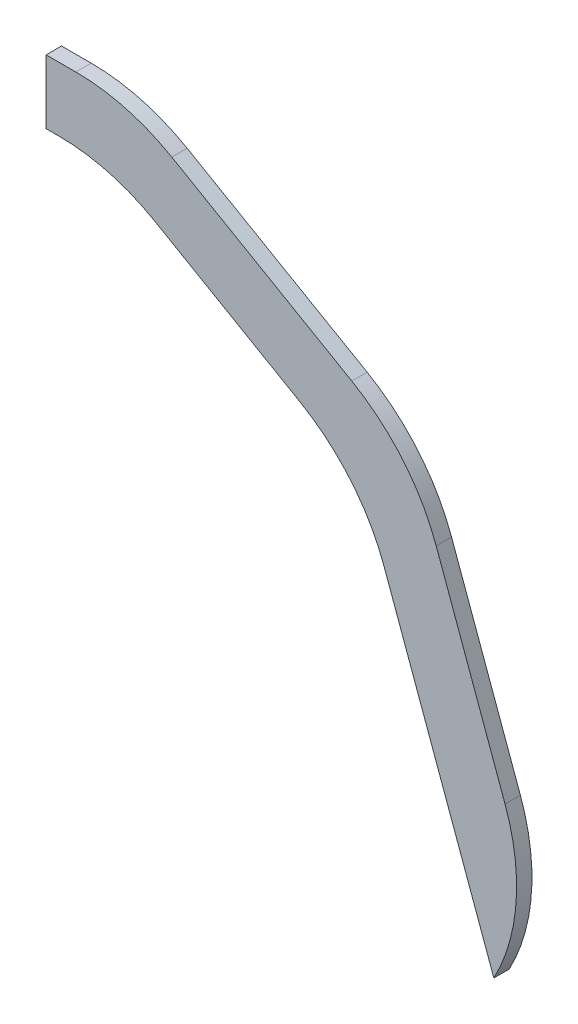
ISO-10303-21;
HEADER;
FILE_DESCRIPTION(('STEP AP214'),'2;1');
FILE_NAME('part.step','',(''),(''),'','','');
FILE_SCHEMA(('AUTOMOTIVE_DESIGN { 1 0 10303 214 1 1 1 1 }'));
ENDSEC;
DATA;
#1=APPLICATION_CONTEXT('core data for automotive mechanical design processes');
#2=APPLICATION_PROTOCOL_DEFINITION('international standard','automotive_design',2000,#1);
#3=PRODUCT_CONTEXT('',#1,'mechanical');
#4=PRODUCT('Part','Part','',(#3));
#5=PRODUCT_RELATED_PRODUCT_CATEGORY('part','',(#4));
#6=PRODUCT_DEFINITION_FORMATION('','',#4);
#7=PRODUCT_DEFINITION_CONTEXT('part definition',#1,'design');
#8=PRODUCT_DEFINITION('design','',#6,#7);
#9=PRODUCT_DEFINITION_SHAPE('','',#8);
#10=(LENGTH_UNIT() NAMED_UNIT(*) SI_UNIT(.MILLI.,.METRE.));
#11=(NAMED_UNIT(*) PLANE_ANGLE_UNIT() SI_UNIT($,.RADIAN.));
#12=(NAMED_UNIT(*) SI_UNIT($,.STERADIAN.) SOLID_ANGLE_UNIT());
#13=UNCERTAINTY_MEASURE_WITH_UNIT(LENGTH_MEASURE(1.E-05),#10,'distance_accuracy_value','');
#14=(GEOMETRIC_REPRESENTATION_CONTEXT(3) GLOBAL_UNCERTAINTY_ASSIGNED_CONTEXT((#13)) GLOBAL_UNIT_ASSIGNED_CONTEXT((#10,
#11,#12)) REPRESENTATION_CONTEXT('',''));
#15=CARTESIAN_POINT('',(0.,0.,0.));
#16=DIRECTION('',(0.,0.,1.));
#17=DIRECTION('',(1.,0.,0.));
#18=AXIS2_PLACEMENT_3D('',#15,#16,#17);
#19=CARTESIAN_POINT('',(0.,1.,0.12));
#20=DIRECTION('',(1.,0.,0.));
#21=DIRECTION('',(0.,1.,0.));
#22=AXIS2_PLACEMENT_3D('',#19,#20,#21);
#23=PLANE('',#22);
#24=DIRECTION('',(0.,-1.,0.));
#25=VECTOR('',#24,1.);
#26=CARTESIAN_POINT('',(0.,1.,-0.12));
#27=LINE('',#26,#25);
#28=CARTESIAN_POINT('',(0.,1.,-0.12));
#29=VERTEX_POINT('',#28);
#30=CARTESIAN_POINT('',(0.,0.,-0.12));
#31=VERTEX_POINT('',#30);
#32=EDGE_CURVE('E154',#29,#31,#27,.T.);
#33=ORIENTED_EDGE('',*,*,#32,.T.);
#34=DIRECTION('',(0.,0.,-1.));
#35=VECTOR('',#34,1.);
#36=CARTESIAN_POINT('',(0.,0.,0.12));
#37=LINE('',#36,#35);
#38=CARTESIAN_POINT('',(0.,0.,0.12));
#39=VERTEX_POINT('',#38);
#40=EDGE_CURVE('E133',#39,#31,#37,.T.);
#41=ORIENTED_EDGE('',*,*,#40,.F.);
#42=DIRECTION('',(0.,-1.,0.));
#43=VECTOR('',#42,1.);
#44=CARTESIAN_POINT('',(0.,1.,0.12));
#45=LINE('',#44,#43);
#46=CARTESIAN_POINT('',(0.,1.,0.12));
#47=VERTEX_POINT('',#46);
#48=EDGE_CURVE('E140',#47,#39,#45,.T.);
#49=ORIENTED_EDGE('',*,*,#48,.F.);
#50=DIRECTION('',(0.,0.,-1.));
#51=VECTOR('',#50,1.);
#52=CARTESIAN_POINT('',(0.,1.,0.12));
#53=LINE('',#52,#51);
#54=EDGE_CURVE('E165',#47,#29,#53,.T.);
#55=ORIENTED_EDGE('',*,*,#54,.T.);
#56=EDGE_LOOP('',(#33,#41,#49,#55));
#57=FACE_BOUND('',#56,.T.);
#58=ADVANCED_FACE('F38',(#57),#23,.F.);
#59=CARTESIAN_POINT('',(0.,0.,0.12));
#60=DIRECTION('',(0.,1.,0.));
#61=DIRECTION('',(0.,0.,1.));
#62=AXIS2_PLACEMENT_3D('',#59,#60,#61);
#63=PLANE('',#62);
#64=DIRECTION('',(1.,0.,0.));
#65=VECTOR('',#64,1.);
#66=CARTESIAN_POINT('',(0.,0.,-0.12));
#67=LINE('',#66,#65);
#68=CARTESIAN_POINT('',(0.19615242270663,0.,-0.12));
#69=VERTEX_POINT('',#68);
#70=EDGE_CURVE('E221',#31,#69,#67,.T.);
#71=ORIENTED_EDGE('',*,*,#70,.T.);
#72=DIRECTION('',(0.,0.,-1.));
#73=VECTOR('',#72,1.);
#74=CARTESIAN_POINT('',(0.19615242270663,0.,0.12));
#75=LINE('',#74,#73);
#76=CARTESIAN_POINT('',(0.19615242270663,0.,0.12));
#77=VERTEX_POINT('',#76);
#78=EDGE_CURVE('E136',#69,#77,#75,.F.);
#79=ORIENTED_EDGE('',*,*,#78,.T.);
#80=DIRECTION('',(1.,0.,0.));
#81=VECTOR('',#80,1.);
#82=CARTESIAN_POINT('',(0.,0.,0.12));
#83=LINE('',#82,#81);
#84=EDGE_CURVE('E128',#39,#77,#83,.T.);
#85=ORIENTED_EDGE('',*,*,#84,.F.);
#86=ORIENTED_EDGE('',*,*,#40,.T.);
#87=EDGE_LOOP('',(#71,#79,#85,#86));
#88=FACE_BOUND('',#87,.T.);
#89=ADVANCED_FACE('F131',(#88),#63,.F.);
#90=CARTESIAN_POINT('',(1.,0.,0.12));
#91=DIRECTION('',(0.500000000000001,0.866025403784438,0.));
#92=DIRECTION('',(-0.866025403784438,0.500000000000001,0.));
#93=AXIS2_PLACEMENT_3D('',#90,#91,#92);
#94=PLANE('',#93);
#95=DIRECTION('',(0.866025403784438,-0.500000000000001,0.));
#96=VECTOR('',#95,1.);
#97=CARTESIAN_POINT('',(1.,0.,-0.12));
#98=LINE('',#97,#96);
#99=CARTESIAN_POINT('',(1.69615242270663,-0.401923788646686,-0.12));
#100=VERTEX_POINT('',#99);
#101=CARTESIAN_POINT('',(3.96422431099867,-1.71139570389352,-0.12));
#102=VERTEX_POINT('',#101);
#103=EDGE_CURVE('E223',#100,#102,#98,.T.);
#104=ORIENTED_EDGE('',*,*,#103,.T.);
#105=DIRECTION('',(0.,0.,-1.));
#106=VECTOR('',#105,1.);
#107=CARTESIAN_POINT('',(3.96422431099867,-1.71139570389352,0.12));
#108=LINE('',#107,#106);
#109=CARTESIAN_POINT('',(3.96422431099867,-1.71139570389352,0.12));
#110=VERTEX_POINT('',#109);
#111=EDGE_CURVE('E206',#102,#110,#108,.F.);
#112=ORIENTED_EDGE('',*,*,#111,.T.);
#113=DIRECTION('',(0.866025403784438,-0.500000000000001,0.));
#114=VECTOR('',#113,1.);
#115=CARTESIAN_POINT('',(1.,0.,0.12));
#116=LINE('',#115,#114);
#117=CARTESIAN_POINT('',(1.69615242270663,-0.401923788646686,0.12));
#118=VERTEX_POINT('',#117);
#119=EDGE_CURVE('E139',#118,#110,#116,.T.);
#120=ORIENTED_EDGE('',*,*,#119,.F.);
#121=DIRECTION('',(0.,0.,-1.));
#122=VECTOR('',#121,1.);
#123=CARTESIAN_POINT('',(1.69615242270663,-0.401923788646686,-0.12));
#124=LINE('',#123,#122);
#125=EDGE_CURVE('E202',#118,#100,#124,.T.);
#126=ORIENTED_EDGE('',*,*,#125,.T.);
#127=EDGE_LOOP('',(#104,#112,#120,#126));
#128=FACE_BOUND('',#127,.T.);
#129=ADVANCED_FACE('F232',(#128),#94,.F.);
#130=CARTESIAN_POINT('',(4.90984671828639,-2.25735105529283,0.12));
#131=DIRECTION('',(0.939692620785909,0.342020143325666,0.));
#132=DIRECTION('',(-0.342020143325666,0.939692620785909,0.));
#133=AXIS2_PLACEMENT_3D('',#130,#131,#132);
#134=PLANE('',#133);
#135=DIRECTION('',(0.342020143325666,-0.939692620785909,0.));
#136=VECTOR('',#135,1.);
#137=CARTESIAN_POINT('',(4.90984671828639,-2.25735105529283,0.12));
#138=LINE('',#137,#136);
#139=CARTESIAN_POINT('',(5.2833021733564,-3.28341148526984,0.12));
#140=VERTEX_POINT('',#139);
#141=CARTESIAN_POINT('',(7.,-8.,0.12));
#142=VERTEX_POINT('',#141);
#143=EDGE_CURVE('E235',#140,#142,#138,.T.);
#144=ORIENTED_EDGE('',*,*,#143,.F.);
#145=DIRECTION('',(0.,0.,-1.));
#146=VECTOR('',#145,1.);
#147=CARTESIAN_POINT('',(5.2833021733564,-3.28341148526984,-0.12));
#148=LINE('',#147,#146);
#149=CARTESIAN_POINT('',(5.2833021733564,-3.28341148526984,-0.12));
#150=VERTEX_POINT('',#149);
#151=EDGE_CURVE('E198',#140,#150,#148,.T.);
#152=ORIENTED_EDGE('',*,*,#151,.T.);
#153=DIRECTION('',(0.342020143325666,-0.939692620785909,0.));
#154=VECTOR('',#153,1.);
#155=CARTESIAN_POINT('',(4.90984671828639,-2.25735105529283,-0.12));
#156=LINE('',#155,#154);
#157=CARTESIAN_POINT('',(7.,-8.,-0.12));
#158=VERTEX_POINT('',#157);
#159=EDGE_CURVE('E252',#150,#158,#156,.T.);
#160=ORIENTED_EDGE('',*,*,#159,.T.);
#161=DIRECTION('',(0.,0.,-1.));
#162=VECTOR('',#161,1.);
#163=CARTESIAN_POINT('',(7.,-8.,0.12));
#164=LINE('',#163,#162);
#165=EDGE_CURVE('E157',#142,#158,#164,.T.);
#166=ORIENTED_EDGE('',*,*,#165,.F.);
#167=EDGE_LOOP('',(#144,#152,#160,#166));
#168=FACE_BOUND('',#167,.T.);
#169=ADVANCED_FACE('F289',(#168),#134,.F.);
#170=CARTESIAN_POINT('',(7.65270364466614,-6.86948412515286,0.12));
#171=DIRECTION('',(-0.939692620785909,-0.342020143325666,0.));
#172=DIRECTION('',(0.342020143325666,-0.939692620785909,0.));
#173=AXIS2_PLACEMENT_3D('',#170,#171,#172);
#174=PLANE('',#173);
#175=DIRECTION('',(-0.342020143325666,0.939692620785909,0.));
#176=VECTOR('',#175,1.);
#177=CARTESIAN_POINT('',(7.65270364466614,-6.86948412515286,-0.12));
#178=LINE('',#177,#176);
#179=CARTESIAN_POINT('',(7.1749123306355,-5.55676327864211,-0.12));
#180=VERTEX_POINT('',#179);
#181=CARTESIAN_POINT('',(6.0985096424523,-2.5993711986185,-0.12));
#182=VERTEX_POINT('',#181);
#183=EDGE_CURVE('E256',#180,#182,#178,.T.);
#184=ORIENTED_EDGE('',*,*,#183,.T.);
#185=DIRECTION('',(0.,0.,-1.));
#186=VECTOR('',#185,1.);
#187=CARTESIAN_POINT('',(6.0985096424523,-2.5993711986185,0.12));
#188=LINE('',#187,#186);
#189=CARTESIAN_POINT('',(6.0985096424523,-2.5993711986185,0.12));
#190=VERTEX_POINT('',#189);
#191=EDGE_CURVE('E54',#182,#190,#188,.F.);
#192=ORIENTED_EDGE('',*,*,#191,.T.);
#193=DIRECTION('',(-0.342020143325666,0.939692620785909,0.));
#194=VECTOR('',#193,1.);
#195=CARTESIAN_POINT('',(7.65270364466614,-6.86948412515286,0.12));
#196=LINE('',#195,#194);
#197=CARTESIAN_POINT('',(7.1749123306355,-5.55676327864211,0.12));
#198=VERTEX_POINT('',#197);
#199=EDGE_CURVE('E238',#198,#190,#196,.T.);
#200=ORIENTED_EDGE('',*,*,#199,.F.);
#201=DIRECTION('',(0.,0.,-1.));
#202=VECTOR('',#201,1.);
#203=CARTESIAN_POINT('',(7.1749123306355,-5.55676327864211,0.12));
#204=LINE('',#203,#202);
#205=EDGE_CURVE('E192',#198,#180,#204,.T.);
#206=ORIENTED_EDGE('',*,*,#205,.T.);
#207=EDGE_LOOP('',(#184,#192,#200,#206));
#208=FACE_BOUND('',#207,.T.);
#209=ADVANCED_FACE('F281',(#208),#174,.F.);
#210=CARTESIAN_POINT('',(5.72505418738229,-1.57331076864149,0.12));
#211=DIRECTION('',(-0.500000000000001,-0.866025403784438,0.));
#212=DIRECTION('',(0.866025403784438,-0.500000000000001,0.));
#213=AXIS2_PLACEMENT_3D('',#210,#211,#212);
#214=PLANE('',#213);
#215=DIRECTION('',(-0.866025403784438,0.500000000000001,0.));
#216=VECTOR('',#215,1.);
#217=CARTESIAN_POINT('',(5.72505418738229,-1.57331076864149,-0.12));
#218=LINE('',#217,#216);
#219=CARTESIAN_POINT('',(4.77943178009458,-1.02735541724218,-0.12));
#220=VERTEX_POINT('',#219);
#221=CARTESIAN_POINT('',(1.96410161513776,0.598076211353314,-0.12));
#222=VERTEX_POINT('',#221);
#223=EDGE_CURVE('E259',#220,#222,#218,.T.);
#224=ORIENTED_EDGE('',*,*,#223,.T.);
#225=DIRECTION('',(0.,0.,-1.));
#226=VECTOR('',#225,1.);
#227=CARTESIAN_POINT('',(1.96410161513776,0.598076211353314,0.12));
#228=LINE('',#227,#226);
#229=CARTESIAN_POINT('',(1.96410161513776,0.598076211353314,0.12));
#230=VERTEX_POINT('',#229);
#231=EDGE_CURVE('E181',#222,#230,#228,.F.);
#232=ORIENTED_EDGE('',*,*,#231,.T.);
#233=DIRECTION('',(-0.866025403784438,0.500000000000001,0.));
#234=VECTOR('',#233,1.);
#235=CARTESIAN_POINT('',(5.72505418738229,-1.57331076864149,0.12));
#236=LINE('',#235,#234);
#237=CARTESIAN_POINT('',(4.77943178009458,-1.02735541724218,0.12));
#238=VERTEX_POINT('',#237);
#239=EDGE_CURVE('E243',#238,#230,#236,.T.);
#240=ORIENTED_EDGE('',*,*,#239,.F.);
#241=DIRECTION('',(0.,0.,-1.));
#242=VECTOR('',#241,1.);
#243=CARTESIAN_POINT('',(4.77943178009458,-1.02735541724218,0.12));
#244=LINE('',#243,#242);
#245=EDGE_CURVE('E177',#238,#220,#244,.T.);
#246=ORIENTED_EDGE('',*,*,#245,.T.);
#247=EDGE_LOOP('',(#224,#232,#240,#246));
#248=FACE_BOUND('',#247,.T.);
#249=ADVANCED_FACE('F275',(#248),#214,.F.);
#250=CARTESIAN_POINT('',(1.26794919243112,1.,0.12));
#251=DIRECTION('',(0.,-1.,0.));
#252=DIRECTION('',(1.,0.,0.));
#253=AXIS2_PLACEMENT_3D('',#250,#251,#252);
#254=PLANE('',#253);
#255=DIRECTION('',(-1.,0.,0.));
#256=VECTOR('',#255,1.);
#257=CARTESIAN_POINT('',(1.26794919243112,1.,0.12));
#258=LINE('',#257,#256);
#259=CARTESIAN_POINT('',(0.464101615137752,1.,0.12));
#260=VERTEX_POINT('',#259);
#261=EDGE_CURVE('E146',#260,#47,#258,.T.);
#262=ORIENTED_EDGE('',*,*,#261,.F.);
#263=DIRECTION('',(0.,0.,-1.));
#264=VECTOR('',#263,1.);
#265=CARTESIAN_POINT('',(0.464101615137752,1.,0.12));
#266=LINE('',#265,#264);
#267=CARTESIAN_POINT('',(0.464101615137752,1.,-0.12));
#268=VERTEX_POINT('',#267);
#269=EDGE_CURVE('E156',#260,#268,#266,.T.);
#270=ORIENTED_EDGE('',*,*,#269,.T.);
#271=DIRECTION('',(-1.,0.,0.));
#272=VECTOR('',#271,1.);
#273=CARTESIAN_POINT('',(1.26794919243112,1.,-0.12));
#274=LINE('',#273,#272);
#275=EDGE_CURVE('E151',#268,#29,#274,.T.);
#276=ORIENTED_EDGE('',*,*,#275,.T.);
#277=ORIENTED_EDGE('',*,*,#54,.F.);
#278=EDGE_LOOP('',(#262,#270,#276,#277));
#279=FACE_BOUND('',#278,.T.);
#280=ADVANCED_FACE('F267',(#279),#254,.F.);
#281=CARTESIAN_POINT('',(0.,0.,0.12));
#282=DIRECTION('',(0.,0.,1.));
#283=DIRECTION('',(1.,0.,0.));
#284=AXIS2_PLACEMENT_3D('',#281,#282,#283);
#285=PLANE('',#284);
#286=ORIENTED_EDGE('',*,*,#239,.T.);
#287=CARTESIAN_POINT('',(0.464101615137753,-2.,0.12));
#288=DIRECTION('',(0.,0.,1.));
#289=DIRECTION('',(1.,0.,0.));
#290=AXIS2_PLACEMENT_3D('',#287,#288,#289);
#291=CIRCLE('',#290,3.);
#292=EDGE_CURVE('E189',#230,#260,#291,.T.);
#293=ORIENTED_EDGE('',*,*,#292,.T.);
#294=ORIENTED_EDGE('',*,*,#261,.T.);
#295=ORIENTED_EDGE('',*,*,#48,.T.);
#296=ORIENTED_EDGE('',*,*,#84,.T.);
#297=CARTESIAN_POINT('',(0.19615242270663,-3.,0.12));
#298=DIRECTION('',(0.,0.,1.));
#299=DIRECTION('',(1.,0.,0.));
#300=AXIS2_PLACEMENT_3D('',#297,#298,#299);
#301=CIRCLE('',#300,3.);
#302=EDGE_CURVE('E11',#77,#118,#301,.F.);
#303=ORIENTED_EDGE('',*,*,#302,.T.);
#304=ORIENTED_EDGE('',*,*,#119,.T.);
#305=CARTESIAN_POINT('',(2.46422431099867,-4.30947191524684,0.12));
#306=DIRECTION('',(0.,0.,1.));
#307=DIRECTION('',(1.,0.,0.));
#308=AXIS2_PLACEMENT_3D('',#305,#306,#307);
#309=CIRCLE('',#308,3.);
#310=EDGE_CURVE('E214',#110,#140,#309,.F.);
#311=ORIENTED_EDGE('',*,*,#310,.T.);
#312=ORIENTED_EDGE('',*,*,#143,.T.);
#313=CARTESIAN_POINT('',(4.35583446827777,-6.58282370861911,0.12));
#314=DIRECTION('',(0.,0.,1.));
#315=DIRECTION('',(1.,0.,0.));
#316=AXIS2_PLACEMENT_3D('',#313,#314,#315);
#317=CIRCLE('',#316,3.);
#318=EDGE_CURVE('E61',#142,#198,#317,.T.);
#319=ORIENTED_EDGE('',*,*,#318,.T.);
#320=ORIENTED_EDGE('',*,*,#199,.T.);
#321=CARTESIAN_POINT('',(3.27943178009457,-3.6254316285955,0.12));
#322=DIRECTION('',(0.,0.,1.));
#323=DIRECTION('',(1.,0.,0.));
#324=AXIS2_PLACEMENT_3D('',#321,#322,#323);
#325=CIRCLE('',#324,3.);
#326=EDGE_CURVE('E186',#190,#238,#325,.T.);
#327=ORIENTED_EDGE('',*,*,#326,.T.);
#328=EDGE_LOOP('',(#286,#293,#294,#295,#296,#303,#304,#311,#312,#319,#320,#327));
#329=FACE_BOUND('',#328,.T.);
#330=ADVANCED_FACE('F144',(#329),#285,.T.);
#331=CARTESIAN_POINT('',(0.,0.,-0.12));
#332=DIRECTION('',(0.,0.,1.));
#333=DIRECTION('',(1.,0.,0.));
#334=AXIS2_PLACEMENT_3D('',#331,#332,#333);
#335=PLANE('',#334);
#336=ORIENTED_EDGE('',*,*,#275,.F.);
#337=CARTESIAN_POINT('',(0.464101615137753,-2.,-0.12));
#338=DIRECTION('',(0.,0.,1.));
#339=DIRECTION('',(1.,0.,0.));
#340=AXIS2_PLACEMENT_3D('',#337,#338,#339);
#341=CIRCLE('',#340,3.);
#342=EDGE_CURVE('E174',#268,#222,#341,.F.);
#343=ORIENTED_EDGE('',*,*,#342,.T.);
#344=ORIENTED_EDGE('',*,*,#223,.F.);
#345=CARTESIAN_POINT('',(3.27943178009457,-3.6254316285955,-0.12));
#346=DIRECTION('',(0.,0.,1.));
#347=DIRECTION('',(1.,0.,0.));
#348=AXIS2_PLACEMENT_3D('',#345,#346,#347);
#349=CIRCLE('',#348,3.);
#350=EDGE_CURVE('E171',#220,#182,#349,.F.);
#351=ORIENTED_EDGE('',*,*,#350,.T.);
#352=ORIENTED_EDGE('',*,*,#183,.F.);
#353=CARTESIAN_POINT('',(4.35583446827777,-6.58282370861911,-0.12));
#354=DIRECTION('',(0.,0.,1.));
#355=DIRECTION('',(1.,0.,0.));
#356=AXIS2_PLACEMENT_3D('',#353,#354,#355);
#357=CIRCLE('',#356,3.);
#358=EDGE_CURVE('E162',#180,#158,#357,.F.);
#359=ORIENTED_EDGE('',*,*,#358,.T.);
#360=ORIENTED_EDGE('',*,*,#159,.F.);
#361=CARTESIAN_POINT('',(2.46422431099867,-4.30947191524684,-0.12));
#362=DIRECTION('',(0.,0.,1.));
#363=DIRECTION('',(1.,0.,0.));
#364=AXIS2_PLACEMENT_3D('',#361,#362,#363);
#365=CIRCLE('',#364,3.);
#366=EDGE_CURVE('E211',#150,#102,#365,.T.);
#367=ORIENTED_EDGE('',*,*,#366,.T.);
#368=ORIENTED_EDGE('',*,*,#103,.F.);
#369=CARTESIAN_POINT('',(0.19615242270663,-3.,-0.12));
#370=DIRECTION('',(0.,0.,1.));
#371=DIRECTION('',(1.,0.,0.));
#372=AXIS2_PLACEMENT_3D('',#369,#370,#371);
#373=CIRCLE('',#372,3.);
#374=EDGE_CURVE('E47',#100,#69,#373,.T.);
#375=ORIENTED_EDGE('',*,*,#374,.T.);
#376=ORIENTED_EDGE('',*,*,#70,.F.);
#377=ORIENTED_EDGE('',*,*,#32,.F.);
#378=EDGE_LOOP('',(#336,#343,#344,#351,#352,#359,#360,#367,#368,#375,#376,#377));
#379=FACE_BOUND('',#378,.T.);
#380=ADVANCED_FACE('F220',(#379),#335,.F.);
#381=CARTESIAN_POINT('',(0.464101615137753,-2.,0.12));
#382=DIRECTION('',(0.,0.,-1.));
#383=DIRECTION('',(-1.,0.,0.));
#384=AXIS2_PLACEMENT_3D('',#381,#382,#383);
#385=CYLINDRICAL_SURFACE('',#384,3.);
#386=ORIENTED_EDGE('',*,*,#292,.F.);
#387=ORIENTED_EDGE('',*,*,#231,.F.);
#388=ORIENTED_EDGE('',*,*,#342,.F.);
#389=ORIENTED_EDGE('',*,*,#269,.F.);
#390=EDGE_LOOP('',(#386,#387,#388,#389));
#391=FACE_BOUND('',#390,.T.);
#392=ADVANCED_FACE('F271',(#391),#385,.T.);
#393=CARTESIAN_POINT('',(3.27943178009457,-3.6254316285955,0.12));
#394=DIRECTION('',(0.,0.,-1.));
#395=DIRECTION('',(-1.,0.,0.));
#396=AXIS2_PLACEMENT_3D('',#393,#394,#395);
#397=CYLINDRICAL_SURFACE('',#396,3.);
#398=ORIENTED_EDGE('',*,*,#326,.F.);
#399=ORIENTED_EDGE('',*,*,#191,.F.);
#400=ORIENTED_EDGE('',*,*,#350,.F.);
#401=ORIENTED_EDGE('',*,*,#245,.F.);
#402=EDGE_LOOP('',(#398,#399,#400,#401));
#403=FACE_BOUND('',#402,.T.);
#404=ADVANCED_FACE('F279',(#403),#397,.T.);
#405=CARTESIAN_POINT('',(4.35583446827777,-6.58282370861911,0.12));
#406=DIRECTION('',(0.,0.,-1.));
#407=DIRECTION('',(-1.,0.,0.));
#408=AXIS2_PLACEMENT_3D('',#405,#406,#407);
#409=CYLINDRICAL_SURFACE('',#408,3.);
#410=ORIENTED_EDGE('',*,*,#318,.F.);
#411=ORIENTED_EDGE('',*,*,#165,.T.);
#412=ORIENTED_EDGE('',*,*,#358,.F.);
#413=ORIENTED_EDGE('',*,*,#205,.F.);
#414=EDGE_LOOP('',(#410,#411,#412,#413));
#415=FACE_BOUND('',#414,.T.);
#416=ADVANCED_FACE('F284',(#415),#409,.T.);
#417=CARTESIAN_POINT('',(2.46422431099867,-4.30947191524684,0.12));
#418=DIRECTION('',(0.,0.,1.));
#419=DIRECTION('',(1.,0.,0.));
#420=AXIS2_PLACEMENT_3D('',#417,#418,#419);
#421=CYLINDRICAL_SURFACE('',#420,3.);
#422=ORIENTED_EDGE('',*,*,#310,.F.);
#423=ORIENTED_EDGE('',*,*,#111,.F.);
#424=ORIENTED_EDGE('',*,*,#366,.F.);
#425=ORIENTED_EDGE('',*,*,#151,.F.);
#426=EDGE_LOOP('',(#422,#423,#424,#425));
#427=FACE_BOUND('',#426,.T.);
#428=ADVANCED_FACE('F292',(#427),#421,.F.);
#429=CARTESIAN_POINT('',(0.19615242270663,-3.,0.12));
#430=DIRECTION('',(0.,0.,1.));
#431=DIRECTION('',(1.,0.,0.));
#432=AXIS2_PLACEMENT_3D('',#429,#430,#431);
#433=CYLINDRICAL_SURFACE('',#432,3.);
#434=ORIENTED_EDGE('',*,*,#302,.F.);
#435=ORIENTED_EDGE('',*,*,#78,.F.);
#436=ORIENTED_EDGE('',*,*,#374,.F.);
#437=ORIENTED_EDGE('',*,*,#125,.F.);
#438=EDGE_LOOP('',(#434,#435,#436,#437));
#439=FACE_BOUND('',#438,.T.);
#440=ADVANCED_FACE('F40',(#439),#433,.F.);
#441=CLOSED_SHELL('',(#58,#89,#129,#169,#209,#249,#280,#330,#380,#392,#404,#416,#428,#440));
#442=MANIFOLD_SOLID_BREP('B2',#441);
#443=ADVANCED_BREP_SHAPE_REPRESENTATION('',(#18,#442),#14);
#444=SHAPE_DEFINITION_REPRESENTATION(#9,#443);
ENDSEC;
END-ISO-10303-21;
